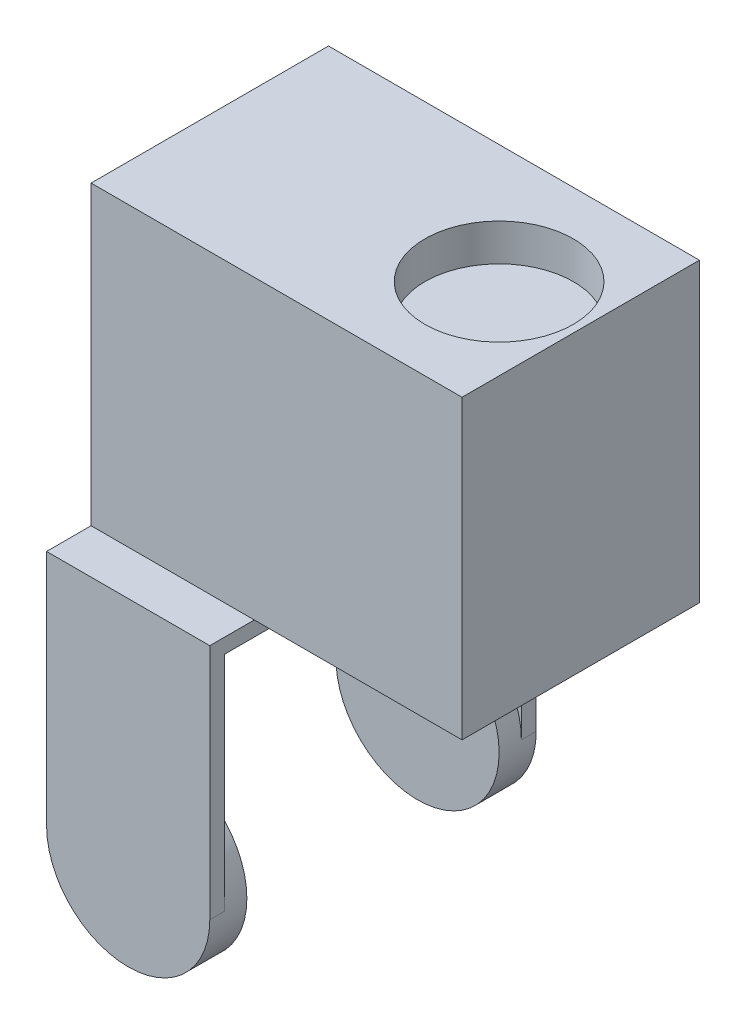
ISO-10303-21;
HEADER;
FILE_DESCRIPTION(('STEP AP214'),'2;1');
FILE_NAME('part.step','',(''),(''),'','','');
FILE_SCHEMA(('AUTOMOTIVE_DESIGN { 1 0 10303 214 1 1 1 1 }'));
ENDSEC;
DATA;
#1=APPLICATION_CONTEXT('core data for automotive mechanical design processes');
#2=APPLICATION_PROTOCOL_DEFINITION('international standard','automotive_design',2000,#1);
#3=PRODUCT_CONTEXT('',#1,'mechanical');
#4=PRODUCT('Part','Part','',(#3));
#5=PRODUCT_RELATED_PRODUCT_CATEGORY('part','',(#4));
#6=PRODUCT_DEFINITION_FORMATION('','',#4);
#7=PRODUCT_DEFINITION_CONTEXT('part definition',#1,'design');
#8=PRODUCT_DEFINITION('design','',#6,#7);
#9=PRODUCT_DEFINITION_SHAPE('','',#8);
#10=(LENGTH_UNIT() NAMED_UNIT(*) SI_UNIT(.MILLI.,.METRE.));
#11=(NAMED_UNIT(*) PLANE_ANGLE_UNIT() SI_UNIT($,.RADIAN.));
#12=(NAMED_UNIT(*) SI_UNIT($,.STERADIAN.) SOLID_ANGLE_UNIT());
#13=UNCERTAINTY_MEASURE_WITH_UNIT(LENGTH_MEASURE(1.E-05),#10,'distance_accuracy_value','');
#14=(GEOMETRIC_REPRESENTATION_CONTEXT(3) GLOBAL_UNCERTAINTY_ASSIGNED_CONTEXT((#13)) GLOBAL_UNIT_ASSIGNED_CONTEXT((#10,
#11,#12)) REPRESENTATION_CONTEXT('',''));
#15=CARTESIAN_POINT('',(0.,0.,0.));
#16=DIRECTION('',(0.,0.,1.));
#17=DIRECTION('',(1.,0.,0.));
#18=AXIS2_PLACEMENT_3D('',#15,#16,#17);
#19=CARTESIAN_POINT('',(-25.,0.,-32.));
#20=DIRECTION('',(-1.,0.,0.));
#21=DIRECTION('',(0.,0.,1.));
#22=AXIS2_PLACEMENT_3D('',#19,#20,#21);
#23=PLANE('',#22);
#24=DIRECTION('',(0.,0.,1.));
#25=VECTOR('',#24,1.);
#26=CARTESIAN_POINT('',(-25.,-22.,0.));
#27=LINE('',#26,#25);
#28=CARTESIAN_POINT('',(-25.,-22.,-36.));
#29=VERTEX_POINT('',#28);
#30=CARTESIAN_POINT('',(-25.,-22.,4.));
#31=VERTEX_POINT('',#30);
#32=EDGE_CURVE('E159',#29,#31,#27,.T.);
#33=ORIENTED_EDGE('',*,*,#32,.T.);
#34=DIRECTION('',(0.,-1.,0.));
#35=VECTOR('',#34,1.);
#36=CARTESIAN_POINT('',(-25.,0.,3.99999999999999));
#37=LINE('',#36,#35);
#38=CARTESIAN_POINT('',(-25.,-52.,4.));
#39=VERTEX_POINT('',#38);
#40=EDGE_CURVE('E179',#31,#39,#37,.T.);
#41=ORIENTED_EDGE('',*,*,#40,.T.);
#42=DIRECTION('',(0.,0.,1.));
#43=VECTOR('',#42,1.);
#44=CARTESIAN_POINT('',(-25.,-52.,-38.));
#45=LINE('',#44,#43);
#46=CARTESIAN_POINT('',(-25.,-52.,6.));
#47=VERTEX_POINT('',#46);
#48=EDGE_CURVE('E149',#39,#47,#45,.T.);
#49=ORIENTED_EDGE('',*,*,#48,.T.);
#50=DIRECTION('',(0.,-1.,0.));
#51=VECTOR('',#50,1.);
#52=CARTESIAN_POINT('',(-25.,0.,6.));
#53=LINE('',#52,#51);
#54=CARTESIAN_POINT('',(-25.,-20.,6.));
#55=VERTEX_POINT('',#54);
#56=EDGE_CURVE('E193',#55,#47,#53,.T.);
#57=ORIENTED_EDGE('',*,*,#56,.F.);
#58=DIRECTION('',(0.,0.,-1.));
#59=VECTOR('',#58,1.);
#60=CARTESIAN_POINT('',(-25.,-20.,6.));
#61=LINE('',#60,#59);
#62=CARTESIAN_POINT('',(-25.,-20.,0.));
#63=VERTEX_POINT('',#62);
#64=EDGE_CURVE('E205',#55,#63,#61,.T.);
#65=ORIENTED_EDGE('',*,*,#64,.T.);
#66=DIRECTION('',(0.,-1.,0.));
#67=VECTOR('',#66,1.);
#68=CARTESIAN_POINT('',(-25.,0.,0.));
#69=LINE('',#68,#67);
#70=CARTESIAN_POINT('',(-25.,20.,0.));
#71=VERTEX_POINT('',#70);
#72=EDGE_CURVE('E238',#71,#63,#69,.T.);
#73=ORIENTED_EDGE('',*,*,#72,.F.);
#74=DIRECTION('',(0.,0.,1.));
#75=VECTOR('',#74,1.);
#76=CARTESIAN_POINT('',(-25.,20.,-32.));
#77=LINE('',#76,#75);
#78=CARTESIAN_POINT('',(-25.,20.,-32.));
#79=VERTEX_POINT('',#78);
#80=EDGE_CURVE('E244',#79,#71,#77,.T.);
#81=ORIENTED_EDGE('',*,*,#80,.F.);
#82=DIRECTION('',(0.,-1.,0.));
#83=VECTOR('',#82,1.);
#84=CARTESIAN_POINT('',(-25.,0.,-32.));
#85=LINE('',#84,#83);
#86=CARTESIAN_POINT('',(-25.,-20.,-32.));
#87=VERTEX_POINT('',#86);
#88=EDGE_CURVE('E228',#79,#87,#85,.T.);
#89=ORIENTED_EDGE('',*,*,#88,.T.);
#90=DIRECTION('',(0.,0.,1.));
#91=VECTOR('',#90,1.);
#92=CARTESIAN_POINT('',(-25.,-20.,-38.));
#93=LINE('',#92,#91);
#94=CARTESIAN_POINT('',(-25.,-20.,-38.));
#95=VERTEX_POINT('',#94);
#96=EDGE_CURVE('E217',#95,#87,#93,.T.);
#97=ORIENTED_EDGE('',*,*,#96,.F.);
#98=DIRECTION('',(0.,-1.,0.));
#99=VECTOR('',#98,1.);
#100=CARTESIAN_POINT('',(-25.,0.,-38.));
#101=LINE('',#100,#99);
#102=CARTESIAN_POINT('',(-25.,-52.,-38.));
#103=VERTEX_POINT('',#102);
#104=EDGE_CURVE('E143',#95,#103,#101,.T.);
#105=ORIENTED_EDGE('',*,*,#104,.T.);
#106=CARTESIAN_POINT('',(-25.,-52.,-36.));
#107=VERTEX_POINT('',#106);
#108=EDGE_CURVE('E138',#103,#107,#45,.T.);
#109=ORIENTED_EDGE('',*,*,#108,.T.);
#110=DIRECTION('',(0.,-1.,0.));
#111=VECTOR('',#110,1.);
#112=CARTESIAN_POINT('',(-25.,0.,-36.));
#113=LINE('',#112,#111);
#114=EDGE_CURVE('E141',#29,#107,#113,.T.);
#115=ORIENTED_EDGE('',*,*,#114,.F.);
#116=EDGE_LOOP('',(#33,#41,#49,#57,#65,#73,#81,#89,#97,#105,#109,#115));
#117=FACE_BOUND('',#116,.T.);
#118=ADVANCED_FACE('F36',(#117),#23,.T.);
#119=CARTESIAN_POINT('',(-3.,0.,-38.));
#120=DIRECTION('',(-1.,0.,0.));
#121=DIRECTION('',(0.,0.,1.));
#122=AXIS2_PLACEMENT_3D('',#119,#120,#121);
#123=PLANE('',#122);
#124=DIRECTION('',(0.,-1.,0.));
#125=VECTOR('',#124,1.);
#126=CARTESIAN_POINT('',(-3.,0.,3.99999999999999));
#127=LINE('',#126,#125);
#128=CARTESIAN_POINT('',(-3.,-22.,4.));
#129=VERTEX_POINT('',#128);
#130=CARTESIAN_POINT('',(-3.,-52.,4.));
#131=VERTEX_POINT('',#130);
#132=EDGE_CURVE('E158',#129,#131,#127,.T.);
#133=ORIENTED_EDGE('',*,*,#132,.F.);
#134=DIRECTION('',(0.,0.,1.));
#135=VECTOR('',#134,1.);
#136=CARTESIAN_POINT('',(-3.,-22.,0.));
#137=LINE('',#136,#135);
#138=CARTESIAN_POINT('',(-3.,-22.,-36.));
#139=VERTEX_POINT('',#138);
#140=EDGE_CURVE('E182',#139,#129,#137,.T.);
#141=ORIENTED_EDGE('',*,*,#140,.F.);
#142=DIRECTION('',(0.,-1.,0.));
#143=VECTOR('',#142,1.);
#144=CARTESIAN_POINT('',(-3.,0.,-36.));
#145=LINE('',#144,#143);
#146=CARTESIAN_POINT('',(-3.,-52.,-36.));
#147=VERTEX_POINT('',#146);
#148=EDGE_CURVE('E184',#139,#147,#145,.T.);
#149=ORIENTED_EDGE('',*,*,#148,.T.);
#150=DIRECTION('',(0.,0.,1.));
#151=VECTOR('',#150,1.);
#152=CARTESIAN_POINT('',(-3.,-52.,-38.));
#153=LINE('',#152,#151);
#154=CARTESIAN_POINT('',(-3.,-52.,-38.));
#155=VERTEX_POINT('',#154);
#156=EDGE_CURVE('E165',#155,#147,#153,.T.);
#157=ORIENTED_EDGE('',*,*,#156,.F.);
#158=DIRECTION('',(0.,-1.,0.));
#159=VECTOR('',#158,1.);
#160=CARTESIAN_POINT('',(-3.,0.,-38.));
#161=LINE('',#160,#159);
#162=CARTESIAN_POINT('',(-3.,-20.,-38.));
#163=VERTEX_POINT('',#162);
#164=EDGE_CURVE('E213',#163,#155,#161,.T.);
#165=ORIENTED_EDGE('',*,*,#164,.F.);
#166=DIRECTION('',(0.,0.,1.));
#167=VECTOR('',#166,1.);
#168=CARTESIAN_POINT('',(-3.,-20.,-38.));
#169=LINE('',#168,#167);
#170=CARTESIAN_POINT('',(-3.,-20.,-32.));
#171=VERTEX_POINT('',#170);
#172=EDGE_CURVE('E221',#163,#171,#169,.T.);
#173=ORIENTED_EDGE('',*,*,#172,.T.);
#174=CARTESIAN_POINT('',(-3.,-20.,0.));
#175=VERTEX_POINT('',#174);
#176=EDGE_CURVE('E44',#171,#175,#169,.T.);
#177=ORIENTED_EDGE('',*,*,#176,.T.);
#178=DIRECTION('',(0.,0.,-1.));
#179=VECTOR('',#178,1.);
#180=CARTESIAN_POINT('',(-3.,-20.,6.));
#181=LINE('',#180,#179);
#182=CARTESIAN_POINT('',(-3.,-20.,6.));
#183=VERTEX_POINT('',#182);
#184=EDGE_CURVE('E208',#183,#175,#181,.T.);
#185=ORIENTED_EDGE('',*,*,#184,.F.);
#186=DIRECTION('',(0.,-1.,0.));
#187=VECTOR('',#186,1.);
#188=CARTESIAN_POINT('',(-3.,0.,6.));
#189=LINE('',#188,#187);
#190=CARTESIAN_POINT('',(-3.,-52.,6.));
#191=VERTEX_POINT('',#190);
#192=EDGE_CURVE('E199',#183,#191,#189,.T.);
#193=ORIENTED_EDGE('',*,*,#192,.T.);
#194=EDGE_CURVE('E148',#131,#191,#153,.T.);
#195=ORIENTED_EDGE('',*,*,#194,.F.);
#196=EDGE_LOOP('',(#133,#141,#149,#157,#165,#173,#177,#185,#193,#195));
#197=FACE_BOUND('',#196,.T.);
#198=ADVANCED_FACE('F261',(#197),#123,.F.);
#199=CARTESIAN_POINT('',(-14.,-52.,-38.));
#200=DIRECTION('',(0.,0.,1.));
#201=DIRECTION('',(1.,0.,0.));
#202=AXIS2_PLACEMENT_3D('',#199,#200,#201);
#203=CYLINDRICAL_SURFACE('',#202,11.);
#204=ORIENTED_EDGE('',*,*,#48,.F.);
#205=CARTESIAN_POINT('',(-14.,-52.,4.));
#206=DIRECTION('',(0.,0.,-1.));
#207=DIRECTION('',(0.,1.,0.));
#208=AXIS2_PLACEMENT_3D('',#205,#206,#207);
#209=CIRCLE('',#208,11.);
#210=EDGE_CURVE('E11',#131,#39,#209,.F.);
#211=ORIENTED_EDGE('',*,*,#210,.F.);
#212=ORIENTED_EDGE('',*,*,#194,.T.);
#213=CARTESIAN_POINT('',(-14.,-52.,6.));
#214=DIRECTION('',(0.,0.,1.));
#215=DIRECTION('',(1.,0.,0.));
#216=AXIS2_PLACEMENT_3D('',#213,#214,#215);
#217=CIRCLE('',#216,11.);
#218=EDGE_CURVE('E196',#47,#191,#217,.T.);
#219=ORIENTED_EDGE('',*,*,#218,.F.);
#220=EDGE_LOOP('',(#204,#211,#212,#219));
#221=FACE_BOUND('',#220,.T.);
#222=CARTESIAN_POINT('',(-14.,-52.,1.));
#223=DIRECTION('',(0.,0.,-1.));
#224=DIRECTION('',(0.,1.,0.));
#225=AXIS2_PLACEMENT_3D('',#222,#223,#224);
#226=CIRCLE('',#225,11.);
#227=CARTESIAN_POINT('',(-14.,-41.,0.999999999999999));
#228=VERTEX_POINT('',#227);
#229=EDGE_CURVE('E170',#228,#228,#226,.T.);
#230=ORIENTED_EDGE('',*,*,#229,.F.);
#231=EDGE_LOOP('',(#230));
#232=FACE_BOUND('',#231,.T.);
#233=ADVANCED_FACE('F286',(#221,#232),#203,.T.);
#234=CARTESIAN_POINT('',(0.,0.,0.));
#235=DIRECTION('',(0.,0.,1.));
#236=DIRECTION('',(1.,0.,0.));
#237=AXIS2_PLACEMENT_3D('',#234,#235,#236);
#238=PLANE('',#237);
#239=ORIENTED_EDGE('',*,*,#72,.T.);
#240=DIRECTION('',(1.,0.,0.));
#241=VECTOR('',#240,1.);
#242=CARTESIAN_POINT('',(0.,-20.,0.));
#243=LINE('',#242,#241);
#244=EDGE_CURVE('E191',#63,#175,#243,.T.);
#245=ORIENTED_EDGE('',*,*,#244,.T.);
#246=DIRECTION('',(1.,0.,0.));
#247=VECTOR('',#246,1.);
#248=CARTESIAN_POINT('',(0.,-20.,0.));
#249=LINE('',#248,#247);
#250=CARTESIAN_POINT('',(25.,-20.,0.));
#251=VERTEX_POINT('',#250);
#252=EDGE_CURVE('E74',#175,#251,#249,.T.);
#253=ORIENTED_EDGE('',*,*,#252,.T.);
#254=DIRECTION('',(0.,-1.,0.));
#255=VECTOR('',#254,1.);
#256=CARTESIAN_POINT('',(25.,0.,0.));
#257=LINE('',#256,#255);
#258=CARTESIAN_POINT('',(25.,20.,0.));
#259=VERTEX_POINT('',#258);
#260=EDGE_CURVE('E220',#259,#251,#257,.T.);
#261=ORIENTED_EDGE('',*,*,#260,.F.);
#262=DIRECTION('',(1.,0.,0.));
#263=VECTOR('',#262,1.);
#264=CARTESIAN_POINT('',(0.,20.,0.));
#265=LINE('',#264,#263);
#266=EDGE_CURVE('E236',#71,#259,#265,.T.);
#267=ORIENTED_EDGE('',*,*,#266,.F.);
#268=EDGE_LOOP('',(#239,#245,#253,#261,#267));
#269=FACE_BOUND('',#268,.T.);
#270=ADVANCED_FACE('F251',(#269),#238,.T.);
#271=CARTESIAN_POINT('',(25.,0.,-32.));
#272=DIRECTION('',(-1.,0.,0.));
#273=DIRECTION('',(0.,0.,1.));
#274=AXIS2_PLACEMENT_3D('',#271,#272,#273);
#275=PLANE('',#274);
#276=ORIENTED_EDGE('',*,*,#260,.T.);
#277=DIRECTION('',(0.,0.,1.));
#278=VECTOR('',#277,1.);
#279=CARTESIAN_POINT('',(25.,-20.,-32.));
#280=LINE('',#279,#278);
#281=CARTESIAN_POINT('',(25.,-20.,-32.));
#282=VERTEX_POINT('',#281);
#283=EDGE_CURVE('E242',#282,#251,#280,.T.);
#284=ORIENTED_EDGE('',*,*,#283,.F.);
#285=DIRECTION('',(0.,-1.,0.));
#286=VECTOR('',#285,1.);
#287=CARTESIAN_POINT('',(25.,0.,-32.));
#288=LINE('',#287,#286);
#289=CARTESIAN_POINT('',(25.,20.,-32.));
#290=VERTEX_POINT('',#289);
#291=EDGE_CURVE('E225',#290,#282,#288,.T.);
#292=ORIENTED_EDGE('',*,*,#291,.F.);
#293=DIRECTION('',(0.,0.,1.));
#294=VECTOR('',#293,1.);
#295=CARTESIAN_POINT('',(25.,20.,-32.));
#296=LINE('',#295,#294);
#297=EDGE_CURVE('E233',#290,#259,#296,.T.);
#298=ORIENTED_EDGE('',*,*,#297,.T.);
#299=EDGE_LOOP('',(#276,#284,#292,#298));
#300=FACE_BOUND('',#299,.T.);
#301=ADVANCED_FACE('F38',(#300),#275,.F.);
#302=CARTESIAN_POINT('',(0.,-20.,-32.));
#303=DIRECTION('',(0.,-1.,0.));
#304=DIRECTION('',(0.,0.,-1.));
#305=AXIS2_PLACEMENT_3D('',#302,#303,#304);
#306=PLANE('',#305);
#307=ORIENTED_EDGE('',*,*,#176,.F.);
#308=DIRECTION('',(1.,0.,0.));
#309=VECTOR('',#308,1.);
#310=CARTESIAN_POINT('',(0.,-20.,-32.));
#311=LINE('',#310,#309);
#312=EDGE_CURVE('E55',#171,#282,#311,.T.);
#313=ORIENTED_EDGE('',*,*,#312,.T.);
#314=ORIENTED_EDGE('',*,*,#283,.T.);
#315=ORIENTED_EDGE('',*,*,#252,.F.);
#316=EDGE_LOOP('',(#307,#313,#314,#315));
#317=FACE_BOUND('',#316,.T.);
#318=ADVANCED_FACE('F258',(#317),#306,.T.);
#319=CARTESIAN_POINT('',(0.,20.,-32.));
#320=DIRECTION('',(0.,-1.,0.));
#321=DIRECTION('',(0.,0.,-1.));
#322=AXIS2_PLACEMENT_3D('',#319,#320,#321);
#323=PLANE('',#322);
#324=CARTESIAN_POINT('',(14.,20.,-16.));
#325=DIRECTION('',(0.,1.,0.));
#326=DIRECTION('',(0.,0.,1.));
#327=AXIS2_PLACEMENT_3D('',#324,#325,#326);
#328=CIRCLE('',#327,10.);
#329=CARTESIAN_POINT('',(14.,20.,-6.));
#330=VERTEX_POINT('',#329);
#331=EDGE_CURVE('E173',#330,#330,#328,.T.);
#332=ORIENTED_EDGE('',*,*,#331,.F.);
#333=EDGE_LOOP('',(#332));
#334=FACE_BOUND('',#333,.T.);
#335=ORIENTED_EDGE('',*,*,#266,.T.);
#336=ORIENTED_EDGE('',*,*,#297,.F.);
#337=DIRECTION('',(1.,0.,0.));
#338=VECTOR('',#337,1.);
#339=CARTESIAN_POINT('',(0.,20.,-32.));
#340=LINE('',#339,#338);
#341=EDGE_CURVE('E80',#79,#290,#340,.T.);
#342=ORIENTED_EDGE('',*,*,#341,.F.);
#343=ORIENTED_EDGE('',*,*,#80,.T.);
#344=EDGE_LOOP('',(#335,#336,#342,#343));
#345=FACE_BOUND('',#344,.T.);
#346=ADVANCED_FACE('F271',(#334,#345),#323,.F.);
#347=CARTESIAN_POINT('',(0.,0.,-32.));
#348=DIRECTION('',(0.,0.,1.));
#349=DIRECTION('',(1.,0.,0.));
#350=AXIS2_PLACEMENT_3D('',#347,#348,#349);
#351=PLANE('',#350);
#352=ORIENTED_EDGE('',*,*,#291,.T.);
#353=ORIENTED_EDGE('',*,*,#312,.F.);
#354=EDGE_CURVE('E230',#87,#171,#311,.T.);
#355=ORIENTED_EDGE('',*,*,#354,.F.);
#356=ORIENTED_EDGE('',*,*,#88,.F.);
#357=ORIENTED_EDGE('',*,*,#341,.T.);
#358=EDGE_LOOP('',(#352,#353,#355,#356,#357));
#359=FACE_BOUND('',#358,.T.);
#360=ADVANCED_FACE('F269',(#359),#351,.F.);
#361=CARTESIAN_POINT('',(0.,-20.,-38.));
#362=DIRECTION('',(0.,-1.,0.));
#363=DIRECTION('',(0.,0.,-1.));
#364=AXIS2_PLACEMENT_3D('',#361,#362,#363);
#365=PLANE('',#364);
#366=ORIENTED_EDGE('',*,*,#96,.T.);
#367=ORIENTED_EDGE('',*,*,#354,.T.);
#368=ORIENTED_EDGE('',*,*,#172,.F.);
#369=DIRECTION('',(1.,0.,0.));
#370=VECTOR('',#369,1.);
#371=CARTESIAN_POINT('',(0.,-20.,-38.));
#372=LINE('',#371,#370);
#373=EDGE_CURVE('E215',#95,#163,#372,.T.);
#374=ORIENTED_EDGE('',*,*,#373,.F.);
#375=EDGE_LOOP('',(#366,#367,#368,#374));
#376=FACE_BOUND('',#375,.T.);
#377=ADVANCED_FACE('F267',(#376),#365,.F.);
#378=ORIENTED_EDGE('',*,*,#156,.T.);
#379=CARTESIAN_POINT('',(-14.,-52.,-36.));
#380=DIRECTION('',(0.,0.,1.));
#381=DIRECTION('',(1.,0.,0.));
#382=AXIS2_PLACEMENT_3D('',#379,#380,#381);
#383=CIRCLE('',#382,11.);
#384=EDGE_CURVE('E154',#147,#107,#383,.T.);
#385=ORIENTED_EDGE('',*,*,#384,.T.);
#386=ORIENTED_EDGE('',*,*,#108,.F.);
#387=CARTESIAN_POINT('',(-14.,-52.,-38.));
#388=DIRECTION('',(0.,0.,1.));
#389=DIRECTION('',(1.,0.,0.));
#390=AXIS2_PLACEMENT_3D('',#387,#388,#389);
#391=CIRCLE('',#390,11.);
#392=EDGE_CURVE('E211',#103,#155,#391,.T.);
#393=ORIENTED_EDGE('',*,*,#392,.T.);
#394=EDGE_LOOP('',(#378,#385,#386,#393));
#395=FACE_BOUND('',#394,.T.);
#396=CARTESIAN_POINT('',(-14.,-52.,-33.));
#397=DIRECTION('',(0.,0.,1.));
#398=DIRECTION('',(1.,0.,0.));
#399=AXIS2_PLACEMENT_3D('',#396,#397,#398);
#400=CIRCLE('',#399,11.);
#401=CARTESIAN_POINT('',(-3.,-52.,-33.));
#402=VERTEX_POINT('',#401);
#403=EDGE_CURVE('E166',#402,#402,#400,.T.);
#404=ORIENTED_EDGE('',*,*,#403,.F.);
#405=EDGE_LOOP('',(#404));
#406=FACE_BOUND('',#405,.T.);
#407=ADVANCED_FACE('F162',(#395,#406),#203,.T.);
#408=CARTESIAN_POINT('',(0.,0.,-38.));
#409=DIRECTION('',(0.,0.,1.));
#410=DIRECTION('',(1.,0.,0.));
#411=AXIS2_PLACEMENT_3D('',#408,#409,#410);
#412=PLANE('',#411);
#413=ORIENTED_EDGE('',*,*,#104,.F.);
#414=ORIENTED_EDGE('',*,*,#373,.T.);
#415=ORIENTED_EDGE('',*,*,#164,.T.);
#416=ORIENTED_EDGE('',*,*,#392,.F.);
#417=EDGE_LOOP('',(#413,#414,#415,#416));
#418=FACE_BOUND('',#417,.T.);
#419=ADVANCED_FACE('F301',(#418),#412,.F.);
#420=CARTESIAN_POINT('',(0.,-20.,6.));
#421=DIRECTION('',(0.,1.,0.));
#422=DIRECTION('',(0.,0.,1.));
#423=AXIS2_PLACEMENT_3D('',#420,#421,#422);
#424=PLANE('',#423);
#425=ORIENTED_EDGE('',*,*,#244,.F.);
#426=ORIENTED_EDGE('',*,*,#64,.F.);
#427=DIRECTION('',(1.,0.,0.));
#428=VECTOR('',#427,1.);
#429=CARTESIAN_POINT('',(0.,-20.,6.));
#430=LINE('',#429,#428);
#431=EDGE_CURVE('E202',#55,#183,#430,.T.);
#432=ORIENTED_EDGE('',*,*,#431,.T.);
#433=ORIENTED_EDGE('',*,*,#184,.T.);
#434=EDGE_LOOP('',(#425,#426,#432,#433));
#435=FACE_BOUND('',#434,.T.);
#436=ADVANCED_FACE('F257',(#435),#424,.T.);
#437=CARTESIAN_POINT('',(0.,0.,6.));
#438=DIRECTION('',(0.,0.,1.));
#439=DIRECTION('',(1.,0.,0.));
#440=AXIS2_PLACEMENT_3D('',#437,#438,#439);
#441=PLANE('',#440);
#442=ORIENTED_EDGE('',*,*,#56,.T.);
#443=ORIENTED_EDGE('',*,*,#218,.T.);
#444=ORIENTED_EDGE('',*,*,#192,.F.);
#445=ORIENTED_EDGE('',*,*,#431,.F.);
#446=EDGE_LOOP('',(#442,#443,#444,#445));
#447=FACE_BOUND('',#446,.T.);
#448=ADVANCED_FACE('F310',(#447),#441,.T.);
#449=CARTESIAN_POINT('',(-3.,0.,3.99999999999999));
#450=DIRECTION('',(0.,0.,-1.));
#451=DIRECTION('',(0.,1.,0.));
#452=AXIS2_PLACEMENT_3D('',#449,#450,#451);
#453=PLANE('',#452);
#454=ORIENTED_EDGE('',*,*,#132,.T.);
#455=ORIENTED_EDGE('',*,*,#210,.T.);
#456=ORIENTED_EDGE('',*,*,#40,.F.);
#457=DIRECTION('',(-1.,0.,0.));
#458=VECTOR('',#457,1.);
#459=CARTESIAN_POINT('',(-3.,-22.,4.));
#460=LINE('',#459,#458);
#461=EDGE_CURVE('E186',#129,#31,#460,.T.);
#462=ORIENTED_EDGE('',*,*,#461,.F.);
#463=EDGE_LOOP('',(#454,#455,#456,#462));
#464=FACE_BOUND('',#463,.T.);
#465=ADVANCED_FACE('F315',(#464),#453,.T.);
#466=CARTESIAN_POINT('',(-3.,0.,-36.));
#467=DIRECTION('',(0.,0.,-1.));
#468=DIRECTION('',(0.,1.,0.));
#469=AXIS2_PLACEMENT_3D('',#466,#467,#468);
#470=PLANE('',#469);
#471=ORIENTED_EDGE('',*,*,#384,.F.);
#472=ORIENTED_EDGE('',*,*,#148,.F.);
#473=DIRECTION('',(-1.,0.,0.));
#474=VECTOR('',#473,1.);
#475=CARTESIAN_POINT('',(-3.,-22.,-36.));
#476=LINE('',#475,#474);
#477=EDGE_CURVE('E156',#139,#29,#476,.T.);
#478=ORIENTED_EDGE('',*,*,#477,.T.);
#479=ORIENTED_EDGE('',*,*,#114,.T.);
#480=EDGE_LOOP('',(#471,#472,#478,#479));
#481=FACE_BOUND('',#480,.T.);
#482=ADVANCED_FACE('F152',(#481),#470,.F.);
#483=CARTESIAN_POINT('',(-3.,-22.,0.));
#484=DIRECTION('',(0.,-1.,0.));
#485=DIRECTION('',(0.,0.,-1.));
#486=AXIS2_PLACEMENT_3D('',#483,#484,#485);
#487=PLANE('',#486);
#488=ORIENTED_EDGE('',*,*,#32,.F.);
#489=ORIENTED_EDGE('',*,*,#477,.F.);
#490=ORIENTED_EDGE('',*,*,#140,.T.);
#491=ORIENTED_EDGE('',*,*,#461,.T.);
#492=EDGE_LOOP('',(#488,#489,#490,#491));
#493=FACE_BOUND('',#492,.T.);
#494=ADVANCED_FACE('F320',(#493),#487,.T.);
#495=CARTESIAN_POINT('',(0.,0.,0.999999999999994));
#496=DIRECTION('',(0.,0.,-1.));
#497=DIRECTION('',(0.,1.,0.));
#498=AXIS2_PLACEMENT_3D('',#495,#496,#497);
#499=PLANE('',#498);
#500=ORIENTED_EDGE('',*,*,#229,.T.);
#501=EDGE_LOOP('',(#500));
#502=FACE_BOUND('',#501,.T.);
#503=ADVANCED_FACE('F323',(#502),#499,.T.);
#504=CARTESIAN_POINT('',(0.,0.,-33.));
#505=DIRECTION('',(0.,0.,1.));
#506=DIRECTION('',(1.,0.,0.));
#507=AXIS2_PLACEMENT_3D('',#504,#505,#506);
#508=PLANE('',#507);
#509=ORIENTED_EDGE('',*,*,#403,.T.);
#510=EDGE_LOOP('',(#509));
#511=FACE_BOUND('',#510,.T.);
#512=ADVANCED_FACE('F329',(#511),#508,.T.);
#513=CARTESIAN_POINT('',(14.,15.,-16.));
#514=DIRECTION('',(0.,1.,0.));
#515=DIRECTION('',(0.,0.,1.));
#516=AXIS2_PLACEMENT_3D('',#513,#514,#515);
#517=CYLINDRICAL_SURFACE('',#516,10.);
#518=CARTESIAN_POINT('',(14.,15.,-16.));
#519=DIRECTION('',(0.,1.,0.));
#520=DIRECTION('',(0.,0.,1.));
#521=AXIS2_PLACEMENT_3D('',#518,#519,#520);
#522=CIRCLE('',#521,10.);
#523=CARTESIAN_POINT('',(14.,15.,-6.));
#524=VERTEX_POINT('',#523);
#525=EDGE_CURVE('E167',#524,#524,#522,.T.);
#526=ORIENTED_EDGE('',*,*,#525,.F.);
#527=EDGE_LOOP('',(#526));
#528=FACE_BOUND('',#527,.T.);
#529=ORIENTED_EDGE('',*,*,#331,.T.);
#530=EDGE_LOOP('',(#529));
#531=FACE_BOUND('',#530,.T.);
#532=ADVANCED_FACE('F333',(#528,#531),#517,.F.);
#533=CARTESIAN_POINT('',(0.,15.,0.));
#534=DIRECTION('',(0.,1.,0.));
#535=DIRECTION('',(0.,0.,1.));
#536=AXIS2_PLACEMENT_3D('',#533,#534,#535);
#537=PLANE('',#536);
#538=ORIENTED_EDGE('',*,*,#525,.T.);
#539=EDGE_LOOP('',(#538));
#540=FACE_BOUND('',#539,.T.);
#541=ADVANCED_FACE('F337',(#540),#537,.T.);
#542=CLOSED_SHELL('',(#118,#198,#233,#270,#301,#318,#346,#360,#377,#407,#419,#436,#448,#465,
#482,#494,#503,#512,#532,#541));
#543=MANIFOLD_SOLID_BREP('B2',#542);
#544=ADVANCED_BREP_SHAPE_REPRESENTATION('',(#18,#543),#14);
#545=SHAPE_DEFINITION_REPRESENTATION(#9,#544);
ENDSEC;
END-ISO-10303-21;
